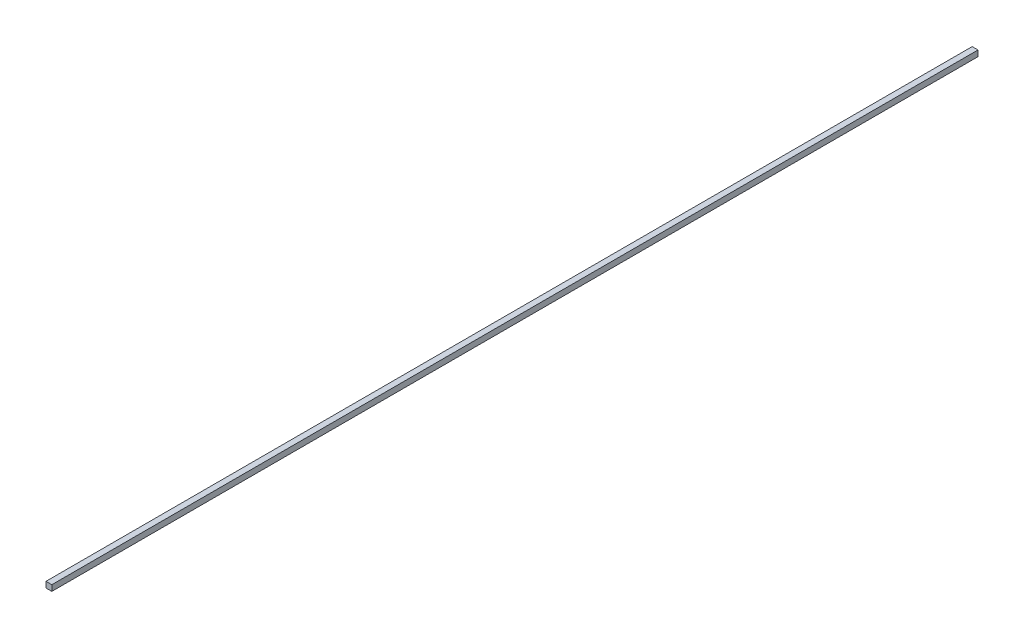
ISO-10303-21;
HEADER;
FILE_DESCRIPTION(('STEP AP214'),'2;1');
FILE_NAME('part.step','',(''),(''),'','','');
FILE_SCHEMA(('AUTOMOTIVE_DESIGN { 1 0 10303 214 1 1 1 1 }'));
ENDSEC;
DATA;
#1=APPLICATION_CONTEXT('core data for automotive mechanical design processes');
#2=APPLICATION_PROTOCOL_DEFINITION('international standard','automotive_design',2000,#1);
#3=PRODUCT_CONTEXT('',#1,'mechanical');
#4=PRODUCT('Part','Part','',(#3));
#5=PRODUCT_RELATED_PRODUCT_CATEGORY('part','',(#4));
#6=PRODUCT_DEFINITION_FORMATION('','',#4);
#7=PRODUCT_DEFINITION_CONTEXT('part definition',#1,'design');
#8=PRODUCT_DEFINITION('design','',#6,#7);
#9=PRODUCT_DEFINITION_SHAPE('','',#8);
#10=(LENGTH_UNIT() NAMED_UNIT(*) SI_UNIT(.MILLI.,.METRE.));
#11=(NAMED_UNIT(*) PLANE_ANGLE_UNIT() SI_UNIT($,.RADIAN.));
#12=(NAMED_UNIT(*) SI_UNIT($,.STERADIAN.) SOLID_ANGLE_UNIT());
#13=UNCERTAINTY_MEASURE_WITH_UNIT(LENGTH_MEASURE(1.E-05),#10,'distance_accuracy_value','');
#14=(GEOMETRIC_REPRESENTATION_CONTEXT(3) GLOBAL_UNCERTAINTY_ASSIGNED_CONTEXT((#13)) GLOBAL_UNIT_ASSIGNED_CONTEXT((#10,
#11,#12)) REPRESENTATION_CONTEXT('',''));
#15=CARTESIAN_POINT('',(0.,0.,0.));
#16=DIRECTION('',(0.,0.,1.));
#17=DIRECTION('',(1.,0.,0.));
#18=AXIS2_PLACEMENT_3D('',#15,#16,#17);
#19=CARTESIAN_POINT('',(-1.,1.,320.247274823427));
#20=DIRECTION('',(1.,0.,0.));
#21=DIRECTION('',(0.,1.,0.));
#22=AXIS2_PLACEMENT_3D('',#19,#20,#21);
#23=PLANE('',#22);
#24=DIRECTION('',(0.,-1.,0.));
#25=VECTOR('',#24,1.);
#26=CARTESIAN_POINT('',(-1.,0.999999999999998,317.418847698681));
#27=LINE('',#26,#25);
#28=CARTESIAN_POINT('',(-0.99999999999992,0.999999999957563,317.418847698681));
#29=VERTEX_POINT('',#28);
#30=CARTESIAN_POINT('',(-1.00000000000006,-1.00000000004244,317.418847698681));
#31=VERTEX_POINT('',#30);
#32=EDGE_CURVE('E36',#29,#31,#27,.T.);
#33=ORIENTED_EDGE('',*,*,#32,.F.);
#34=DIRECTION('',(0.,0.,-1.));
#35=VECTOR('',#34,1.);
#36=CARTESIAN_POINT('',(-1.,1.,320.247274823427));
#37=LINE('',#36,#35);
#38=CARTESIAN_POINT('',(-1.,1.,0.));
#39=VERTEX_POINT('',#38);
#40=EDGE_CURVE('E90',#29,#39,#37,.T.);
#41=ORIENTED_EDGE('',*,*,#40,.T.);
#42=DIRECTION('',(0.,-1.,0.));
#43=VECTOR('',#42,1.);
#44=CARTESIAN_POINT('',(-1.,1.,0.));
#45=LINE('',#44,#43);
#46=CARTESIAN_POINT('',(-1.,-1.,0.));
#47=VERTEX_POINT('',#46);
#48=EDGE_CURVE('E85',#39,#47,#45,.T.);
#49=ORIENTED_EDGE('',*,*,#48,.T.);
#50=DIRECTION('',(0.,0.,-1.));
#51=VECTOR('',#50,1.);
#52=CARTESIAN_POINT('',(-1.,-1.,320.247274823427));
#53=LINE('',#52,#51);
#54=EDGE_CURVE('E70',#31,#47,#53,.T.);
#55=ORIENTED_EDGE('',*,*,#54,.F.);
#56=EDGE_LOOP('',(#33,#41,#49,#55));
#57=FACE_BOUND('',#56,.T.);
#58=ADVANCED_FACE('F33',(#57),#23,.F.);
#59=CARTESIAN_POINT('',(1.,-1.,320.247274823427));
#60=DIRECTION('',(0.,1.,0.));
#61=DIRECTION('',(0.,0.,1.));
#62=AXIS2_PLACEMENT_3D('',#59,#60,#61);
#63=PLANE('',#62);
#64=DIRECTION('',(1.,0.,0.));
#65=VECTOR('',#64,1.);
#66=CARTESIAN_POINT('',(1.,-1.,317.418847698681));
#67=LINE('',#66,#65);
#68=CARTESIAN_POINT('',(0.999999999999938,-1.00000000004258,317.418847698681));
#69=VERTEX_POINT('',#68);
#70=EDGE_CURVE('E48',#31,#69,#67,.T.);
#71=ORIENTED_EDGE('',*,*,#70,.F.);
#72=ORIENTED_EDGE('',*,*,#54,.T.);
#73=DIRECTION('',(1.,0.,0.));
#74=VECTOR('',#73,1.);
#75=CARTESIAN_POINT('',(1.,-1.,0.));
#76=LINE('',#75,#74);
#77=CARTESIAN_POINT('',(1.,-1.,0.));
#78=VERTEX_POINT('',#77);
#79=EDGE_CURVE('E74',#47,#78,#76,.T.);
#80=ORIENTED_EDGE('',*,*,#79,.T.);
#81=DIRECTION('',(0.,0.,-1.));
#82=VECTOR('',#81,1.);
#83=CARTESIAN_POINT('',(1.,-1.,320.247274823427));
#84=LINE('',#83,#82);
#85=EDGE_CURVE('E79',#69,#78,#84,.T.);
#86=ORIENTED_EDGE('',*,*,#85,.F.);
#87=EDGE_LOOP('',(#71,#72,#80,#86));
#88=FACE_BOUND('',#87,.T.);
#89=ADVANCED_FACE('F72',(#88),#63,.F.);
#90=CARTESIAN_POINT('',(1.,1.,320.247274823427));
#91=DIRECTION('',(-1.,0.,0.));
#92=DIRECTION('',(0.,-1.,0.));
#93=AXIS2_PLACEMENT_3D('',#90,#91,#92);
#94=PLANE('',#93);
#95=DIRECTION('',(0.,1.,0.));
#96=VECTOR('',#95,1.);
#97=CARTESIAN_POINT('',(1.,0.999999999999998,317.418847698681));
#98=LINE('',#97,#96);
#99=CARTESIAN_POINT('',(1.,1.,317.418847698681));
#100=VERTEX_POINT('',#99);
#101=EDGE_CURVE('E78',#69,#100,#98,.T.);
#102=ORIENTED_EDGE('',*,*,#101,.F.);
#103=ORIENTED_EDGE('',*,*,#85,.T.);
#104=DIRECTION('',(0.,1.,0.));
#105=VECTOR('',#104,1.);
#106=CARTESIAN_POINT('',(1.,1.,0.));
#107=LINE('',#106,#105);
#108=CARTESIAN_POINT('',(1.,1.,0.));
#109=VERTEX_POINT('',#108);
#110=EDGE_CURVE('E87',#78,#109,#107,.T.);
#111=ORIENTED_EDGE('',*,*,#110,.T.);
#112=DIRECTION('',(0.,0.,-1.));
#113=VECTOR('',#112,1.);
#114=CARTESIAN_POINT('',(1.,1.,320.247274823427));
#115=LINE('',#114,#113);
#116=EDGE_CURVE('E98',#100,#109,#115,.T.);
#117=ORIENTED_EDGE('',*,*,#116,.F.);
#118=EDGE_LOOP('',(#102,#103,#111,#117));
#119=FACE_BOUND('',#118,.T.);
#120=ADVANCED_FACE('F105',(#119),#94,.F.);
#121=CARTESIAN_POINT('',(1.,1.,320.247274823427));
#122=DIRECTION('',(0.,-1.,0.));
#123=DIRECTION('',(1.,0.,0.));
#124=AXIS2_PLACEMENT_3D('',#121,#122,#123);
#125=PLANE('',#124);
#126=DIRECTION('',(-1.,0.,0.));
#127=VECTOR('',#126,1.);
#128=CARTESIAN_POINT('',(1.,1.,317.418847698681));
#129=LINE('',#128,#127);
#130=EDGE_CURVE('E11',#100,#29,#129,.T.);
#131=ORIENTED_EDGE('',*,*,#130,.F.);
#132=ORIENTED_EDGE('',*,*,#116,.T.);
#133=DIRECTION('',(-1.,0.,0.));
#134=VECTOR('',#133,1.);
#135=CARTESIAN_POINT('',(1.,1.,0.));
#136=LINE('',#135,#134);
#137=EDGE_CURVE('E95',#109,#39,#136,.T.);
#138=ORIENTED_EDGE('',*,*,#137,.T.);
#139=ORIENTED_EDGE('',*,*,#40,.F.);
#140=EDGE_LOOP('',(#131,#132,#138,#139));
#141=FACE_BOUND('',#140,.T.);
#142=ADVANCED_FACE('F107',(#141),#125,.F.);
#143=CARTESIAN_POINT('',(0.,0.,0.));
#144=DIRECTION('',(0.,0.,-1.));
#145=DIRECTION('',(-1.,0.,0.));
#146=AXIS2_PLACEMENT_3D('',#143,#144,#145);
#147=PLANE('',#146);
#148=ORIENTED_EDGE('',*,*,#48,.F.);
#149=ORIENTED_EDGE('',*,*,#137,.F.);
#150=ORIENTED_EDGE('',*,*,#110,.F.);
#151=ORIENTED_EDGE('',*,*,#79,.F.);
#152=EDGE_LOOP('',(#148,#149,#150,#151));
#153=FACE_BOUND('',#152,.T.);
#154=ADVANCED_FACE('F83',(#153),#147,.T.);
#155=CARTESIAN_POINT('',(1.00000000000008,0.999999999957422,317.418847698681));
#156=DIRECTION('',(0.,0.,1.));
#157=DIRECTION('',(0.,1.,0.));
#158=AXIS2_PLACEMENT_3D('',#155,#156,#157);
#159=PLANE('',#158);
#160=ORIENTED_EDGE('',*,*,#70,.T.);
#161=ORIENTED_EDGE('',*,*,#101,.T.);
#162=ORIENTED_EDGE('',*,*,#130,.T.);
#163=ORIENTED_EDGE('',*,*,#32,.T.);
#164=EDGE_LOOP('',(#160,#161,#162,#163));
#165=FACE_BOUND('',#164,.T.);
#166=ADVANCED_FACE('F102',(#165),#159,.T.);
#167=CLOSED_SHELL('',(#58,#89,#120,#142,#154,#166));
#168=MANIFOLD_SOLID_BREP('B2',#167);
#169=ADVANCED_BREP_SHAPE_REPRESENTATION('',(#18,#168),#14);
#170=SHAPE_DEFINITION_REPRESENTATION(#9,#169);
ENDSEC;
END-ISO-10303-21;
